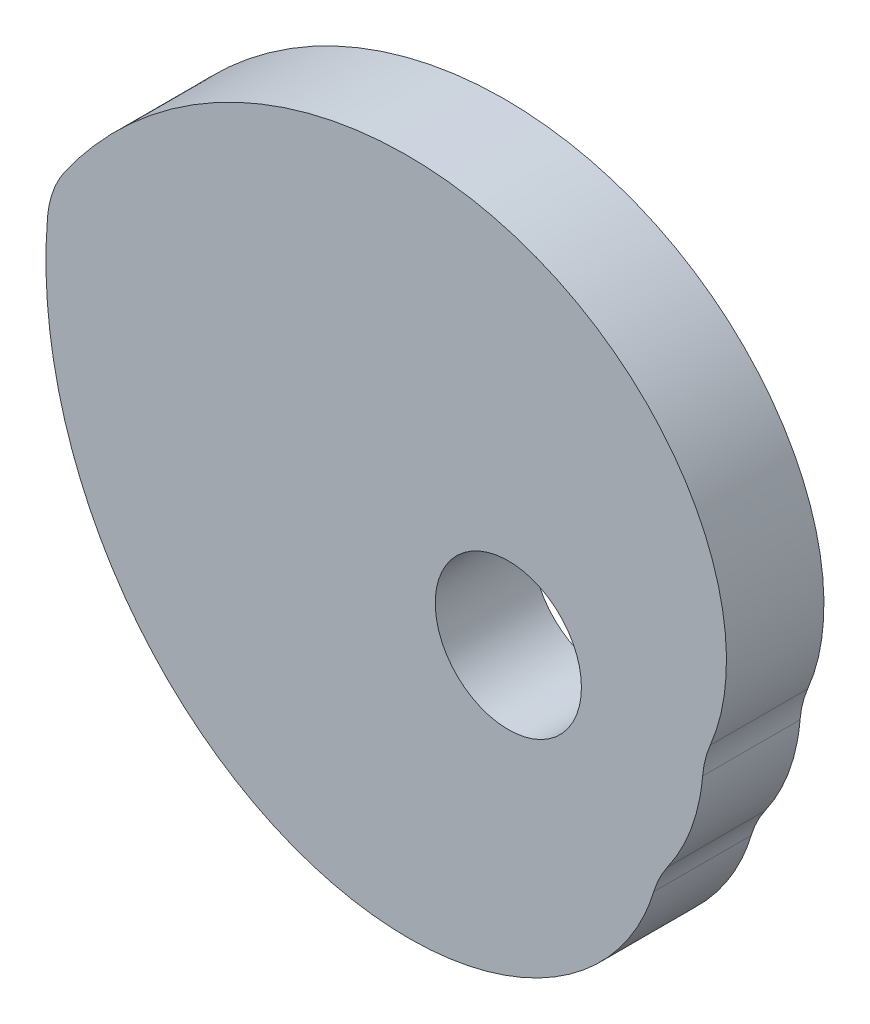
ISO-10303-21;
HEADER;
FILE_DESCRIPTION(('STEP AP214'),'2;1');
FILE_NAME('part.step','',(''),(''),'','','');
FILE_SCHEMA(('AUTOMOTIVE_DESIGN { 1 0 10303 214 1 1 1 1 }'));
ENDSEC;
DATA;
#1=APPLICATION_CONTEXT('core data for automotive mechanical design processes');
#2=APPLICATION_PROTOCOL_DEFINITION('international standard','automotive_design',2000,#1);
#3=PRODUCT_CONTEXT('',#1,'mechanical');
#4=PRODUCT('Part','Part','',(#3));
#5=PRODUCT_RELATED_PRODUCT_CATEGORY('part','',(#4));
#6=PRODUCT_DEFINITION_FORMATION('','',#4);
#7=PRODUCT_DEFINITION_CONTEXT('part definition',#1,'design');
#8=PRODUCT_DEFINITION('design','',#6,#7);
#9=PRODUCT_DEFINITION_SHAPE('','',#8);
#10=(LENGTH_UNIT() NAMED_UNIT(*) SI_UNIT(.MILLI.,.METRE.));
#11=(NAMED_UNIT(*) PLANE_ANGLE_UNIT() SI_UNIT($,.RADIAN.));
#12=(NAMED_UNIT(*) SI_UNIT($,.STERADIAN.) SOLID_ANGLE_UNIT());
#13=UNCERTAINTY_MEASURE_WITH_UNIT(LENGTH_MEASURE(1.E-05),#10,'distance_accuracy_value','');
#14=(GEOMETRIC_REPRESENTATION_CONTEXT(3) GLOBAL_UNCERTAINTY_ASSIGNED_CONTEXT((#13)) GLOBAL_UNIT_ASSIGNED_CONTEXT((#10,
#11,#12)) REPRESENTATION_CONTEXT('',''));
#15=CARTESIAN_POINT('',(0.,0.,0.));
#16=DIRECTION('',(0.,0.,1.));
#17=DIRECTION('',(1.,0.,0.));
#18=AXIS2_PLACEMENT_3D('',#15,#16,#17);
#19=CARTESIAN_POINT('',(18.7938548629415,-6.84044024509855,10.));
#20=DIRECTION('',(0.,0.,-1.));
#21=DIRECTION('',(-1.,0.,0.));
#22=AXIS2_PLACEMENT_3D('',#19,#20,#21);
#23=PLANE('',#22);
#24=CARTESIAN_POINT('',(19.9999999999879,-2.24527674983963E-11,10.));
#25=CARTESIAN_POINT('',(20.0204097483194,0.0379965128148901,10.));
#26=CARTESIAN_POINT('',(20.0609280240814,0.114187013648004,10.));
#27=CARTESIAN_POINT('',(20.1296494196752,0.245531012543593,10.));
#28=CARTESIAN_POINT('',(20.2275241780439,0.436799942401374,10.));
#29=CARTESIAN_POINT('',(20.3208034664597,0.624005392507609,10.));
#30=CARTESIAN_POINT('',(20.4081019037604,0.804544759706207,10.));
#31=CARTESIAN_POINT('',(20.5131313412369,1.02815385264695,10.));
#32=CARTESIAN_POINT('',(20.6363797819472,1.30013818971475,10.));
#33=CARTESIAN_POINT('',(20.7758903482779,1.6222756030741,10.));
#34=CARTESIAN_POINT('',(20.9645617633281,2.084363584331,10.));
#35=CARTESIAN_POINT('',(21.176160839209,2.64559749405615,10.));
#36=CARTESIAN_POINT('',(21.4007629477693,3.30806033936728,10.));
#37=CARTESIAN_POINT('',(21.6273488174109,4.07487951131544,10.));
#38=CARTESIAN_POINT('',(21.823879559792,4.8498522371115,10.));
#39=CARTESIAN_POINT('',(21.9906284990535,5.63181490838659,10.));
#40=CARTESIAN_POINT('',(22.1278049452484,6.41947130743867,10.));
#41=CARTESIAN_POINT('',(22.3436053863841,8.00388273953431,10.));
#42=CARTESIAN_POINT('',(22.4442951122128,10.0042245039902,10.));
#43=CARTESIAN_POINT('',(22.3243066427814,12.2058750284528,10.));
#44=CARTESIAN_POINT('',(21.8654144577139,14.9688026001635,10.));
#45=CARTESIAN_POINT('',(21.194781507287,17.4828155762556,10.));
#46=CARTESIAN_POINT('',(20.1969757731185,20.1038066062594,10.));
#47=CARTESIAN_POINT('',(18.7113489013894,22.9431355717934,10.));
#48=CARTESIAN_POINT('',(16.9138500048525,25.5953748073037,10.));
#49=CARTESIAN_POINT('',(14.8380325404183,28.0353206317477,10.));
#50=CARTESIAN_POINT('',(12.4818259426359,30.2764381155772,10.));
#51=CARTESIAN_POINT('',(9.90555179424934,32.2606211810121,10.));
#52=CARTESIAN_POINT('',(7.14305811783173,33.9753735162547,10.));
#53=CARTESIAN_POINT('',(3.50889536337627,35.7659948198949,10.));
#54=CARTESIAN_POINT('',(-1.03750504825736,37.3421983817775,10.));
#55=CARTESIAN_POINT('',(-5.77604938901733,38.2267587258342,10.));
#56=CARTESIAN_POINT('',(-10.5806024699092,38.4309484621174,10.));
#57=CARTESIAN_POINT('',(-14.5726455619449,38.1616533446731,10.));
#58=CARTESIAN_POINT('',(-17.7383781952531,37.6895165471296,10.));
#59=CARTESIAN_POINT('',(-20.8568128980475,36.9688971417918,10.));
#60=CARTESIAN_POINT('',(-23.9099702533807,36.0090232076047,10.));
#61=CARTESIAN_POINT('',(-26.8812762977102,34.8200135111463,10.));
#62=CARTESIAN_POINT('',(-29.7555133682477,33.4127337098064,10.));
#63=CARTESIAN_POINT('',(-32.5188125113099,31.7986465765908,10.));
#64=CARTESIAN_POINT('',(-34.8285960901609,30.2158714446315,10.));
#65=CARTESIAN_POINT('',(-36.7241333718976,28.7451553234462,10.));
#66=CARTESIAN_POINT('',(-38.2443574482205,27.4475496592739,10.));
#67=CARTESIAN_POINT('',(-39.4237742822328,26.3677550232443,10.));
#68=CARTESIAN_POINT('',(-40.5651565083509,25.2481030311785,10.));
#69=CARTESIAN_POINT('',(-41.6677405990869,24.0897583556483,10.));
#70=CARTESIAN_POINT('',(-42.5972248584368,23.0445249199807,10.));
#71=CARTESIAN_POINT('',(-43.3688549035856,22.1258909750647,10.));
#72=CARTESIAN_POINT('',(-44.1189030097488,21.1916190141886,10.));
#73=CARTESIAN_POINT('',(-44.8496523309867,20.2381583362847,10.));
#74=CARTESIAN_POINT('',(-45.4919080080513,19.3510692233448,10.));
#75=CARTESIAN_POINT('',(-46.0606176003423,18.5223338128647,10.));
#76=CARTESIAN_POINT('',(-46.4427890796628,17.9459927847963,10.));
#77=CARTESIAN_POINT('',(-46.6632646744318,17.6071654053237,10.));
#78=CARTESIAN_POINT('',(-46.8452528544985,17.3219476650775,10.));
#79=CARTESIAN_POINT('',(-46.9387577929684,17.1740612481532,10.));
#80=CARTESIAN_POINT('',(-46.9846310390559,17.1010071666017,10.));
#81=B_SPLINE_CURVE_WITH_KNOTS('',4,(#24,#25,#26,#27,#28,#29,#30,#31,#32,#33,#34,#35,#36,#37,#38,
#39,#40,#41,#42,#43,#44,#45,#46,#47,#48,#49,#50,#51,#52,#53,#54,#55,#56,#57,#58,#59,#60,#61,#62,
#63,#64,#65,#66,#67,#68,#69,#70,#71,#72,#73,#74,#75,#76,#77,#78,#79,#80),.UNSPECIFIED.,.F.,.F.,
(5,1,1,1,1,1,1,1,1,1,1,1,1,1,1,1,1,1,1,1,1,1,1,1,1,1,1,1,1,1,1,1,1,1,1,1,1,1,1,1,1,1,1,1,1,1,1,
1,1,1,1,1,1,5),(0.0503242083772643,0.0520072149040129,0.0536902214307616,0.0553732279575102,
0.0570562344842589,0.0587392410110075,0.0604222475377561,0.0637882605912534,0.0671542736447507,
0.070520286698248,0.0772523128052425,0.0839843545816734,0.0907163963581042,0.097448438134535,
0.104180479910966,0.110912520639153,0.117644561367341,0.151304782348487,0.171500943792439,
0.184965058728134,0.211893340533307,0.238821591242818,0.265749805809011,0.2926780756731,
0.319606256186562,0.346534414236532,0.375101606641735,0.402029828716349,0.428958050790962,
0.482814419792515,0.536670848396968,0.563599054732377,0.590527261067786,0.617455470025173,
0.644383678982561,0.671311911267779,0.698240143552998,0.725168325260391,0.752096506967784,
0.779024722071599,0.792488829623506,0.805952937175413,0.81941704062619,0.832881144076967,
0.846345247527744,0.85980935097852,0.86654141433011,0.873273477681699,0.886737604384878,
0.900201731088057,0.903567762763852,0.906933794439647,0.910299826115442,0.913665857807332),.UNSPECIFIED.);
#82=CARTESIAN_POINT('',(20.7121956288001,1.47705325865104,10.));
#83=VERTEX_POINT('',#82);
#84=CARTESIAN_POINT('',(-45.4742768342118,19.3636683877185,10.));
#85=VERTEX_POINT('',#84);
#86=EDGE_CURVE('E120',#83,#85,#81,.T.);
#87=ORIENTED_EDGE('',*,*,#86,.T.);
#88=CARTESIAN_POINT('',(-37.3154183962621,13.5815382448125,10.));
#89=DIRECTION('',(0.,0.,-1.));
#90=DIRECTION('',(-1.,0.,0.));
#91=AXIS2_PLACEMENT_3D('',#88,#89,#90);
#92=CIRCLE('',#91,10.);
#93=CARTESIAN_POINT('',(-47.2809797508623,14.4107468360002,10.));
#94=VERTEX_POINT('',#93);
#95=EDGE_CURVE('E137',#85,#94,#92,.F.);
#96=ORIENTED_EDGE('',*,*,#95,.T.);
#97=CARTESIAN_POINT('',(-46.9846310394559,17.1010071650349,10.));
#98=CARTESIAN_POINT('',(-47.0082456871718,16.9302527734567,10.));
#99=CARTESIAN_POINT('',(-47.0524535052723,16.5947479586867,10.));
#100=CARTESIAN_POINT('',(-47.1477228803686,15.8344873652796,10.));
#101=CARTESIAN_POINT('',(-47.2145282585826,15.1607151878363,10.));
#102=CARTESIAN_POINT('',(-47.2939655925661,14.2997795026236,10.));
#103=CARTESIAN_POINT('',(-47.3463146566364,13.538629172792,10.));
#104=CARTESIAN_POINT('',(-47.392988991168,12.7221862853459,10.));
#105=CARTESIAN_POINT('',(-47.4224681563362,11.9335386078335,10.));
#106=CARTESIAN_POINT('',(-47.4449464949847,10.930726824676,10.));
#107=CARTESIAN_POINT('',(-47.4440100533896,9.73537639316078,10.));
#108=CARTESIAN_POINT('',(-47.4043610387653,8.33636859835342,10.));
#109=CARTESIAN_POINT('',(-47.3045117637342,6.7427200005541,10.));
#110=CARTESIAN_POINT('',(-47.1118460767452,4.75456572703781,10.));
#111=CARTESIAN_POINT('',(-46.7711628464939,2.38206492022191,10.));
#112=CARTESIAN_POINT('',(-46.2134814329126,-0.359572325500851,10.));
#113=CARTESIAN_POINT('',(-45.3558724861621,-3.43966023382565,10.));
#114=CARTESIAN_POINT('',(-44.4134313444758,-6.07399119269932,10.));
#115=CARTESIAN_POINT('',(-43.4696331236094,-8.27760572432263,10.));
#116=CARTESIAN_POINT('',(-42.5935028912988,-10.0723050508397,10.));
#117=CARTESIAN_POINT('',(-41.8393033212344,-11.4807786587544,10.));
#118=CARTESIAN_POINT('',(-40.8306695483903,-13.2045020761333,10.));
#119=CARTESIAN_POINT('',(-39.5162413622496,-15.2093846473497,10.));
#120=CARTESIAN_POINT('',(-37.8343483377083,-17.4456667376354,10.));
#121=CARTESIAN_POINT('',(-35.7164759706582,-19.8419214086793,10.));
#122=CARTESIAN_POINT('',(-32.8364228977129,-22.6144797646757,10.));
#123=CARTESIAN_POINT('',(-29.0308900403572,-25.5477378650922,10.));
#124=CARTESIAN_POINT('',(-24.8387562860033,-27.9189091912714,10.));
#125=CARTESIAN_POINT('',(-20.3490174463282,-29.638470378975,10.));
#126=CARTESIAN_POINT('',(-16.3978371569557,-30.6131035418182,10.));
#127=CARTESIAN_POINT('',(-13.1608984891533,-31.0804644270731,10.));
#128=CARTESIAN_POINT('',(-9.89285760648513,-31.2172377135783,10.));
#129=CARTESIAN_POINT('',(-6.62860649731071,-31.0109380229328,10.));
#130=CARTESIAN_POINT('',(-3.47318946941449,-30.4740142404615,10.));
#131=CARTESIAN_POINT('',(-0.394676097194339,-29.5961124425629,10.));
#132=CARTESIAN_POINT('',(2.56511220188381,-28.3750067098918,10.));
#133=CARTESIAN_POINT('',(5.36075443962893,-26.8129909463062,10.));
#134=CARTESIAN_POINT('',(7.78176877064147,-25.0363263236066,10.));
#135=CARTESIAN_POINT('',(9.97421790022491,-22.9859434968016,10.));
#136=CARTESIAN_POINT('',(11.6395879197605,-20.986683375703,10.));
#137=CARTESIAN_POINT('',(12.7488108072939,-19.3214147995504,10.));
#138=CARTESIAN_POINT('',(13.5158199765842,-17.9192791991142,10.));
#139=CARTESIAN_POINT('',(13.9063789675469,-17.1098595692014,10.));
#140=CARTESIAN_POINT('',(14.1491007414472,-16.5621527709134,10.));
#141=CARTESIAN_POINT('',(14.3392950578918,-16.1006107121126,10.));
#142=CARTESIAN_POINT('',(14.4840892836061,-15.7283917714127,10.));
#143=CARTESIAN_POINT('',(14.6213730478864,-15.3534331536415,10.));
#144=CARTESIAN_POINT('',(14.7510110913021,-14.9759175006689,10.));
#145=CARTESIAN_POINT('',(14.873112976707,-14.5948559779304,10.));
#146=CARTESIAN_POINT('',(14.9872762371851,-14.211724792835,10.));
#147=CARTESIAN_POINT('',(15.0919629809289,-13.8334610044016,10.));
#148=CARTESIAN_POINT('',(15.1912987381234,-13.4397981853838,10.));
#149=CARTESIAN_POINT('',(15.2669422812024,-13.1079060174855,10.));
#150=CARTESIAN_POINT('',(15.3033259025708,-12.9401330692189,10.));
#151=CARTESIAN_POINT('',(15.3208888626936,-12.855752193845,10.));
#152=B_SPLINE_CURVE_WITH_KNOTS('',4,(#97,#98,#99,#100,#101,#102,#103,#104,#105,#106,#107,#108,
#109,#110,#111,#112,#113,#114,#115,#116,#117,#118,#119,#120,#121,#122,#123,#124,#125,#126,#127,
#128,#129,#130,#131,#132,#133,#134,#135,#136,#137,#138,#139,#140,#141,#142,#143,#144,#145,#146,
#147,#148,#149,#150,#151),.UNSPECIFIED.,.F.,.F.,(5,1,1,1,1,1,1,1,1,1,1,1,1,1,1,1,1,1,1,1,1,1,1,
1,1,1,1,1,1,1,1,1,1,1,1,1,1,1,1,1,1,1,1,1,1,1,1,1,1,1,1,5),(0.0863341423065396,
0.0930605149533579,0.0997868876001762,0.106513260246995,0.113239632893813,0.119966005540631,
0.126692378187449,0.133418750834268,0.140145123481086,0.153597846020344,0.167050568559602,
0.18050329109886,0.193956013638118,0.220861465703268,0.247766917768418,0.27467233838176,
0.301577758995101,0.315030493227828,0.328483227460554,0.34193596169328,0.355388695926006,
0.382294141810194,0.409199587694381,0.436105030563347,0.463010473432313,0.516821377673064,
0.570632207222086,0.597537677137857,0.624443147053627,0.653716037772041,0.68062142158155,
0.70752685352601,0.734432293020325,0.76133769405239,0.788243181078102,0.815148711392046,
0.842054217185708,0.862233311546484,0.889138718294404,0.90259141482238,0.909317764030024,
0.916044113237668,0.919407287841491,0.922770462445313,0.926133628675341,0.92949679490537,
0.932859961135398,0.936223127365427,0.939586293595455,0.942949459825484,0.946312626055512,
0.94967579228554),.UNSPECIFIED.);
#153=CARTESIAN_POINT('',(14.917567959421,-14.443164897138,10.));
#154=VERTEX_POINT('',#153);
#155=EDGE_CURVE('E110',#94,#154,#152,.T.);
#156=ORIENTED_EDGE('',*,*,#155,.T.);
#157=CARTESIAN_POINT('',(24.4945895229399,-17.3207781393756,10.));
#158=DIRECTION('',(0.,0.,-1.));
#159=DIRECTION('',(-1.,0.,0.));
#160=AXIS2_PLACEMENT_3D('',#157,#158,#159);
#161=CIRCLE('',#160,10.);
#162=CARTESIAN_POINT('',(16.3331557690414,-11.5422836052668,10.));
#163=VERTEX_POINT('',#162);
#164=EDGE_CURVE('E60',#154,#163,#161,.T.);
#165=ORIENTED_EDGE('',*,*,#164,.T.);
#166=CARTESIAN_POINT('',(15.3208888625617,-12.8557521940023,10.));
#167=CARTESIAN_POINT('',(15.36548207386,-12.8026080742307,10.));
#168=CARTESIAN_POINT('',(15.4539825668846,-12.6957045048991,10.));
#169=CARTESIAN_POINT('',(15.6631718521004,-12.4399549985542,10.));
#170=CARTESIAN_POINT('',(15.8275258133756,-12.2268936051864,10.));
#171=CARTESIAN_POINT('',(16.052433322957,-11.9330795218907,10.));
#172=CARTESIAN_POINT('',(16.2342623282037,-11.6820183924187,10.));
#173=CARTESIAN_POINT('',(16.4347647489964,-11.4001358463437,10.));
#174=CARTESIAN_POINT('',(16.6168848944818,-11.1315896108564,10.));
#175=CARTESIAN_POINT('',(16.8025566985642,-10.8502793327571,10.));
#176=CARTESIAN_POINT('',(16.9790143470563,-10.5713950365788,10.));
#177=CARTESIAN_POINT('',(17.1965400354153,-10.2158240714843,10.));
#178=CARTESIAN_POINT('',(17.4465815804882,-9.78518290402213,10.));
#179=CARTESIAN_POINT('',(17.7251951731012,-9.27384263695709,10.));
#180=CARTESIAN_POINT('',(18.0234564309182,-8.67969554942382,10.));
#181=CARTESIAN_POINT('',(18.3021068388519,-8.07585230219935,10.));
#182=CARTESIAN_POINT('',(18.5603528893541,-7.46289272350089,10.));
#183=CARTESIAN_POINT('',(18.7981954487022,-6.84221001350287,10.));
#184=CARTESIAN_POINT('',(19.0151994508668,-6.21297987693103,10.));
#185=CARTESIAN_POINT('',(19.2112294389024,-5.57858116913139,10.));
#186=CARTESIAN_POINT('',(19.3860054031515,-4.93517976426152,10.));
#187=CARTESIAN_POINT('',(19.5393727392047,-4.2910226653558,10.));
#188=CARTESIAN_POINT('',(19.6711385014395,-3.63436677889103,10.));
#189=CARTESIAN_POINT('',(19.7811713984607,-2.98652433616239,10.));
#190=CARTESIAN_POINT('',(19.8693410315871,-2.31397220022322,10.));
#191=CARTESIAN_POINT('',(19.935555478229,-1.67557472380869,10.));
#192=CARTESIAN_POINT('',(19.9742151319871,-1.05590856589907,10.));
#193=CARTESIAN_POINT('',(19.993553164701,-0.619587969925683,10.));
#194=CARTESIAN_POINT('',(19.9990790152708,-0.206445905495306,10.));
#195=CARTESIAN_POINT('',(19.9999999999959,-0.0693747215377148,10.));
#196=CARTESIAN_POINT('',(19.9999999999949,-2.03406620702656E-10,10.));
#197=B_SPLINE_CURVE_WITH_KNOTS('',4,(#166,#167,#168,#169,#170,#171,#172,#173,#174,#175,#176,
#177,#178,#179,#180,#181,#182,#183,#184,#185,#186,#187,#188,#189,#190,#191,#192,#193,#194,#195,
#196),.UNSPECIFIED.,.F.,.F.,(5,1,1,1,1,1,1,1,1,1,1,1,1,1,1,1,1,1,1,1,1,1,1,1,1,1,1,5),
(0.0826377295405765,0.102512123356954,0.122386517189105,0.142260911021257,0.162135304853408,
0.18200969868556,0.201884092517711,0.221758486349862,0.241632880182013,0.261507274014164,
0.281381667846314,0.321130455510616,0.360879243174918,0.40062803083922,0.440376818503521,
0.480125606167823,0.519874393832125,0.559623181496428,0.599371969160729,0.639120756825031,
0.678869544489333,0.718618332153637,0.75836711981794,0.798115907482244,0.837864695146548,
0.877613482810855,0.89748787664303,0.917362270489843),.UNSPECIFIED.);
#198=CARTESIAN_POINT('',(19.9312927845428,-1.65789991297878,10.));
#199=VERTEX_POINT('',#198);
#200=EDGE_CURVE('E117',#163,#199,#197,.T.);
#201=ORIENTED_EDGE('',*,*,#200,.T.);
#202=CARTESIAN_POINT('',(29.8977907811906,-2.47577379250868,10.));
#203=DIRECTION('',(0.,0.,-1.));
#204=DIRECTION('',(-1.,0.,0.));
#205=AXIS2_PLACEMENT_3D('',#202,#203,#204);
#206=CIRCLE('',#205,10.);
#207=EDGE_CURVE('E11',#199,#83,#206,.T.);
#208=ORIENTED_EDGE('',*,*,#207,.T.);
#209=EDGE_LOOP('',(#87,#96,#156,#165,#201,#208));
#210=FACE_BOUND('',#209,.T.);
#211=CARTESIAN_POINT('',(0.,0.,10.));
#212=DIRECTION('',(0.,0.,1.));
#213=DIRECTION('',(1.,0.,0.));
#214=AXIS2_PLACEMENT_3D('',#211,#212,#213);
#215=CIRCLE('',#214,7.5);
#216=CARTESIAN_POINT('',(7.5,0.,10.));
#217=VERTEX_POINT('',#216);
#218=EDGE_CURVE('E148',#217,#217,#215,.T.);
#219=ORIENTED_EDGE('',*,*,#218,.F.);
#220=EDGE_LOOP('',(#219));
#221=FACE_BOUND('',#220,.T.);
#222=ADVANCED_FACE('F38',(#210,#221),#23,.F.);
#223=CARTESIAN_POINT('',(18.7938548629415,-6.84044024509855,0.));
#224=DIRECTION('',(0.,0.,-1.));
#225=DIRECTION('',(-1.,0.,0.));
#226=AXIS2_PLACEMENT_3D('',#223,#224,#225);
#227=PLANE('',#226);
#228=CARTESIAN_POINT('',(-46.9846310394559,17.1010071650349,0.));
#229=CARTESIAN_POINT('',(-47.0082456871718,16.9302527734567,0.));
#230=CARTESIAN_POINT('',(-47.0524535052723,16.5947479586867,0.));
#231=CARTESIAN_POINT('',(-47.1477228803686,15.8344873652796,0.));
#232=CARTESIAN_POINT('',(-47.2145282585826,15.1607151878363,0.));
#233=CARTESIAN_POINT('',(-47.2939655925661,14.2997795026236,0.));
#234=CARTESIAN_POINT('',(-47.3463146566364,13.538629172792,0.));
#235=CARTESIAN_POINT('',(-47.392988991168,12.7221862853459,0.));
#236=CARTESIAN_POINT('',(-47.4224681563362,11.9335386078335,0.));
#237=CARTESIAN_POINT('',(-47.4449464949847,10.930726824676,0.));
#238=CARTESIAN_POINT('',(-47.4440100533896,9.73537639316078,0.));
#239=CARTESIAN_POINT('',(-47.4043610387653,8.33636859835342,0.));
#240=CARTESIAN_POINT('',(-47.3045117637342,6.7427200005541,0.));
#241=CARTESIAN_POINT('',(-47.1118460767452,4.75456572703781,0.));
#242=CARTESIAN_POINT('',(-46.7711628464939,2.38206492022191,0.));
#243=CARTESIAN_POINT('',(-46.2134814329126,-0.359572325500851,0.));
#244=CARTESIAN_POINT('',(-45.3558724861621,-3.43966023382565,0.));
#245=CARTESIAN_POINT('',(-44.4134313444758,-6.07399119269932,0.));
#246=CARTESIAN_POINT('',(-43.4696331236094,-8.27760572432263,0.));
#247=CARTESIAN_POINT('',(-42.5935028912988,-10.0723050508397,0.));
#248=CARTESIAN_POINT('',(-41.8393033212344,-11.4807786587544,0.));
#249=CARTESIAN_POINT('',(-40.8306695483903,-13.2045020761333,0.));
#250=CARTESIAN_POINT('',(-39.5162413622496,-15.2093846473497,0.));
#251=CARTESIAN_POINT('',(-37.8343483377083,-17.4456667376354,0.));
#252=CARTESIAN_POINT('',(-35.7164759706582,-19.8419214086793,0.));
#253=CARTESIAN_POINT('',(-32.8364228977129,-22.6144797646757,0.));
#254=CARTESIAN_POINT('',(-29.0308900403572,-25.5477378650922,0.));
#255=CARTESIAN_POINT('',(-24.8387562860033,-27.9189091912714,0.));
#256=CARTESIAN_POINT('',(-20.3490174463282,-29.638470378975,0.));
#257=CARTESIAN_POINT('',(-16.3978371569557,-30.6131035418182,0.));
#258=CARTESIAN_POINT('',(-13.1608984891533,-31.0804644270731,0.));
#259=CARTESIAN_POINT('',(-9.89285760648513,-31.2172377135783,0.));
#260=CARTESIAN_POINT('',(-6.62860649731071,-31.0109380229328,0.));
#261=CARTESIAN_POINT('',(-3.47318946941449,-30.4740142404615,0.));
#262=CARTESIAN_POINT('',(-0.394676097194339,-29.5961124425629,0.));
#263=CARTESIAN_POINT('',(2.56511220188381,-28.3750067098918,0.));
#264=CARTESIAN_POINT('',(5.36075443962893,-26.8129909463062,0.));
#265=CARTESIAN_POINT('',(7.78176877064147,-25.0363263236066,0.));
#266=CARTESIAN_POINT('',(9.97421790022491,-22.9859434968016,0.));
#267=CARTESIAN_POINT('',(11.6395879197605,-20.986683375703,0.));
#268=CARTESIAN_POINT('',(12.7488108072939,-19.3214147995504,0.));
#269=CARTESIAN_POINT('',(13.5158199765842,-17.9192791991142,0.));
#270=CARTESIAN_POINT('',(13.9063789675469,-17.1098595692014,0.));
#271=CARTESIAN_POINT('',(14.1491007414472,-16.5621527709134,0.));
#272=CARTESIAN_POINT('',(14.3392950578918,-16.1006107121126,0.));
#273=CARTESIAN_POINT('',(14.4840892836061,-15.7283917714127,0.));
#274=CARTESIAN_POINT('',(14.6213730478864,-15.3534331536415,0.));
#275=CARTESIAN_POINT('',(14.7510110913021,-14.9759175006689,0.));
#276=CARTESIAN_POINT('',(14.873112976707,-14.5948559779304,0.));
#277=CARTESIAN_POINT('',(14.9872762371851,-14.211724792835,0.));
#278=CARTESIAN_POINT('',(15.0919629809289,-13.8334610044016,0.));
#279=CARTESIAN_POINT('',(15.1912987381234,-13.4397981853838,0.));
#280=CARTESIAN_POINT('',(15.2669422812024,-13.1079060174855,0.));
#281=CARTESIAN_POINT('',(15.3033259025708,-12.9401330692189,0.));
#282=CARTESIAN_POINT('',(15.3208888626936,-12.855752193845,0.));
#283=B_SPLINE_CURVE_WITH_KNOTS('',4,(#228,#229,#230,#231,#232,#233,#234,#235,#236,#237,#238,
#239,#240,#241,#242,#243,#244,#245,#246,#247,#248,#249,#250,#251,#252,#253,#254,#255,#256,#257,
#258,#259,#260,#261,#262,#263,#264,#265,#266,#267,#268,#269,#270,#271,#272,#273,#274,#275,#276,
#277,#278,#279,#280,#281,#282),.UNSPECIFIED.,.F.,.F.,(5,1,1,1,1,1,1,1,1,1,1,1,1,1,1,1,1,1,1,1,1,
1,1,1,1,1,1,1,1,1,1,1,1,1,1,1,1,1,1,1,1,1,1,1,1,1,1,1,1,1,1,5),(0.0863341423065396,
0.0930605149533579,0.0997868876001762,0.106513260246995,0.113239632893813,0.119966005540631,
0.126692378187449,0.133418750834268,0.140145123481086,0.153597846020344,0.167050568559602,
0.18050329109886,0.193956013638118,0.220861465703268,0.247766917768418,0.27467233838176,
0.301577758995101,0.315030493227828,0.328483227460554,0.34193596169328,0.355388695926006,
0.382294141810194,0.409199587694381,0.436105030563347,0.463010473432313,0.516821377673064,
0.570632207222086,0.597537677137857,0.624443147053627,0.653716037772041,0.68062142158155,
0.70752685352601,0.734432293020325,0.76133769405239,0.788243181078102,0.815148711392046,
0.842054217185708,0.862233311546484,0.889138718294404,0.90259141482238,0.909317764030024,
0.916044113237668,0.919407287841491,0.922770462445313,0.926133628675341,0.92949679490537,
0.932859961135398,0.936223127365427,0.939586293595455,0.942949459825484,0.946312626055512,
0.94967579228554),.UNSPECIFIED.);
#284=CARTESIAN_POINT('',(-47.2809797508623,14.4107468360002,0.));
#285=VERTEX_POINT('',#284);
#286=CARTESIAN_POINT('',(14.917567959421,-14.443164897138,0.));
#287=VERTEX_POINT('',#286);
#288=EDGE_CURVE('E108',#285,#287,#283,.T.);
#289=ORIENTED_EDGE('',*,*,#288,.F.);
#290=CARTESIAN_POINT('',(-37.3154183962621,13.5815382448125,0.));
#291=DIRECTION('',(0.,0.,-1.));
#292=DIRECTION('',(-1.,0.,0.));
#293=AXIS2_PLACEMENT_3D('',#290,#291,#292);
#294=CIRCLE('',#293,10.);
#295=CARTESIAN_POINT('',(-45.4742768342118,19.3636683877185,0.));
#296=VERTEX_POINT('',#295);
#297=EDGE_CURVE('E92',#285,#296,#294,.T.);
#298=ORIENTED_EDGE('',*,*,#297,.T.);
#299=CARTESIAN_POINT('',(19.9999999999879,-2.24527674983963E-11,0.));
#300=CARTESIAN_POINT('',(20.0204097483194,0.0379965128148901,0.));
#301=CARTESIAN_POINT('',(20.0609280240814,0.114187013648004,0.));
#302=CARTESIAN_POINT('',(20.1296494196752,0.245531012543593,0.));
#303=CARTESIAN_POINT('',(20.2275241780439,0.436799942401374,0.));
#304=CARTESIAN_POINT('',(20.3208034664597,0.624005392507609,0.));
#305=CARTESIAN_POINT('',(20.4081019037604,0.804544759706207,0.));
#306=CARTESIAN_POINT('',(20.5131313412369,1.02815385264695,0.));
#307=CARTESIAN_POINT('',(20.6363797819472,1.30013818971475,0.));
#308=CARTESIAN_POINT('',(20.7758903482779,1.6222756030741,0.));
#309=CARTESIAN_POINT('',(20.9645617633281,2.084363584331,0.));
#310=CARTESIAN_POINT('',(21.176160839209,2.64559749405615,0.));
#311=CARTESIAN_POINT('',(21.4007629477693,3.30806033936728,0.));
#312=CARTESIAN_POINT('',(21.6273488174109,4.07487951131544,0.));
#313=CARTESIAN_POINT('',(21.823879559792,4.8498522371115,0.));
#314=CARTESIAN_POINT('',(21.9906284990535,5.63181490838659,0.));
#315=CARTESIAN_POINT('',(22.1278049452484,6.41947130743867,0.));
#316=CARTESIAN_POINT('',(22.3436053863841,8.00388273953431,0.));
#317=CARTESIAN_POINT('',(22.4442951122128,10.0042245039902,0.));
#318=CARTESIAN_POINT('',(22.3243066427814,12.2058750284528,0.));
#319=CARTESIAN_POINT('',(21.8654144577139,14.9688026001635,0.));
#320=CARTESIAN_POINT('',(21.194781507287,17.4828155762556,0.));
#321=CARTESIAN_POINT('',(20.1969757731185,20.1038066062594,0.));
#322=CARTESIAN_POINT('',(18.7113489013894,22.9431355717934,0.));
#323=CARTESIAN_POINT('',(16.9138500048525,25.5953748073037,0.));
#324=CARTESIAN_POINT('',(14.8380325404183,28.0353206317477,0.));
#325=CARTESIAN_POINT('',(12.4818259426359,30.2764381155772,0.));
#326=CARTESIAN_POINT('',(9.90555179424934,32.2606211810121,0.));
#327=CARTESIAN_POINT('',(7.14305811783173,33.9753735162547,0.));
#328=CARTESIAN_POINT('',(3.50889536337627,35.7659948198949,0.));
#329=CARTESIAN_POINT('',(-1.03750504825736,37.3421983817775,0.));
#330=CARTESIAN_POINT('',(-5.77604938901733,38.2267587258342,0.));
#331=CARTESIAN_POINT('',(-10.5806024699092,38.4309484621174,0.));
#332=CARTESIAN_POINT('',(-14.5726455619449,38.1616533446731,0.));
#333=CARTESIAN_POINT('',(-17.7383781952531,37.6895165471296,0.));
#334=CARTESIAN_POINT('',(-20.8568128980475,36.9688971417918,0.));
#335=CARTESIAN_POINT('',(-23.9099702533807,36.0090232076047,0.));
#336=CARTESIAN_POINT('',(-26.8812762977102,34.8200135111463,0.));
#337=CARTESIAN_POINT('',(-29.7555133682477,33.4127337098064,0.));
#338=CARTESIAN_POINT('',(-32.5188125113099,31.7986465765908,0.));
#339=CARTESIAN_POINT('',(-34.8285960901609,30.2158714446315,0.));
#340=CARTESIAN_POINT('',(-36.7241333718976,28.7451553234462,0.));
#341=CARTESIAN_POINT('',(-38.2443574482205,27.4475496592739,0.));
#342=CARTESIAN_POINT('',(-39.4237742822328,26.3677550232443,0.));
#343=CARTESIAN_POINT('',(-40.5651565083509,25.2481030311785,0.));
#344=CARTESIAN_POINT('',(-41.6677405990869,24.0897583556483,0.));
#345=CARTESIAN_POINT('',(-42.5972248584368,23.0445249199807,0.));
#346=CARTESIAN_POINT('',(-43.3688549035856,22.1258909750647,0.));
#347=CARTESIAN_POINT('',(-44.1189030097488,21.1916190141886,0.));
#348=CARTESIAN_POINT('',(-44.8496523309867,20.2381583362847,0.));
#349=CARTESIAN_POINT('',(-45.4919080080513,19.3510692233448,0.));
#350=CARTESIAN_POINT('',(-46.0606176003423,18.5223338128647,0.));
#351=CARTESIAN_POINT('',(-46.4427890796628,17.9459927847963,0.));
#352=CARTESIAN_POINT('',(-46.6632646744318,17.6071654053237,0.));
#353=CARTESIAN_POINT('',(-46.8452528544985,17.3219476650775,0.));
#354=CARTESIAN_POINT('',(-46.9387577929684,17.1740612481532,0.));
#355=CARTESIAN_POINT('',(-46.9846310390559,17.1010071666017,0.));
#356=B_SPLINE_CURVE_WITH_KNOTS('',4,(#299,#300,#301,#302,#303,#304,#305,#306,#307,#308,#309,
#310,#311,#312,#313,#314,#315,#316,#317,#318,#319,#320,#321,#322,#323,#324,#325,#326,#327,#328,
#329,#330,#331,#332,#333,#334,#335,#336,#337,#338,#339,#340,#341,#342,#343,#344,#345,#346,#347,
#348,#349,#350,#351,#352,#353,#354,#355),.UNSPECIFIED.,.F.,.F.,(5,1,1,1,1,1,1,1,1,1,1,1,1,1,1,1,
1,1,1,1,1,1,1,1,1,1,1,1,1,1,1,1,1,1,1,1,1,1,1,1,1,1,1,1,1,1,1,1,1,1,1,1,1,5),
(0.0503242083772643,0.0520072149040129,0.0536902214307616,0.0553732279575102,0.0570562344842589,
0.0587392410110075,0.0604222475377561,0.0637882605912534,0.0671542736447507,0.070520286698248,
0.0772523128052425,0.0839843545816734,0.0907163963581042,0.097448438134535,0.104180479910966,
0.110912520639153,0.117644561367341,0.151304782348487,0.171500943792439,0.184965058728134,
0.211893340533307,0.238821591242818,0.265749805809011,0.2926780756731,0.319606256186562,
0.346534414236532,0.375101606641735,0.402029828716349,0.428958050790962,0.482814419792515,
0.536670848396968,0.563599054732377,0.590527261067786,0.617455470025173,0.644383678982561,
0.671311911267779,0.698240143552998,0.725168325260391,0.752096506967784,0.779024722071599,
0.792488829623506,0.805952937175413,0.81941704062619,0.832881144076967,0.846345247527744,
0.85980935097852,0.86654141433011,0.873273477681699,0.886737604384878,0.900201731088057,
0.903567762763852,0.906933794439647,0.910299826115442,0.913665857807332),.UNSPECIFIED.);
#357=CARTESIAN_POINT('',(20.7121956288001,1.47705325865104,0.));
#358=VERTEX_POINT('',#357);
#359=EDGE_CURVE('E118',#358,#296,#356,.T.);
#360=ORIENTED_EDGE('',*,*,#359,.F.);
#361=CARTESIAN_POINT('',(29.8977907811906,-2.47577379250868,0.));
#362=DIRECTION('',(0.,0.,-1.));
#363=DIRECTION('',(-1.,0.,0.));
#364=AXIS2_PLACEMENT_3D('',#361,#362,#363);
#365=CIRCLE('',#364,10.);
#366=CARTESIAN_POINT('',(19.9312927845428,-1.65789991297878,0.));
#367=VERTEX_POINT('',#366);
#368=EDGE_CURVE('E46',#358,#367,#365,.F.);
#369=ORIENTED_EDGE('',*,*,#368,.T.);
#370=CARTESIAN_POINT('',(15.3208888625617,-12.8557521940023,0.));
#371=CARTESIAN_POINT('',(15.36548207386,-12.8026080742307,0.));
#372=CARTESIAN_POINT('',(15.4539825668846,-12.6957045048991,0.));
#373=CARTESIAN_POINT('',(15.6631718521004,-12.4399549985542,0.));
#374=CARTESIAN_POINT('',(15.8275258133756,-12.2268936051864,0.));
#375=CARTESIAN_POINT('',(16.052433322957,-11.9330795218907,0.));
#376=CARTESIAN_POINT('',(16.2342623282037,-11.6820183924187,0.));
#377=CARTESIAN_POINT('',(16.4347647489964,-11.4001358463437,0.));
#378=CARTESIAN_POINT('',(16.6168848944818,-11.1315896108564,0.));
#379=CARTESIAN_POINT('',(16.8025566985642,-10.8502793327571,0.));
#380=CARTESIAN_POINT('',(16.9790143470563,-10.5713950365788,0.));
#381=CARTESIAN_POINT('',(17.1965400354153,-10.2158240714843,0.));
#382=CARTESIAN_POINT('',(17.4465815804882,-9.78518290402213,0.));
#383=CARTESIAN_POINT('',(17.7251951731012,-9.27384263695709,0.));
#384=CARTESIAN_POINT('',(18.0234564309182,-8.67969554942382,0.));
#385=CARTESIAN_POINT('',(18.3021068388519,-8.07585230219935,0.));
#386=CARTESIAN_POINT('',(18.5603528893541,-7.46289272350089,0.));
#387=CARTESIAN_POINT('',(18.7981954487022,-6.84221001350287,0.));
#388=CARTESIAN_POINT('',(19.0151994508668,-6.21297987693103,0.));
#389=CARTESIAN_POINT('',(19.2112294389024,-5.57858116913139,0.));
#390=CARTESIAN_POINT('',(19.3860054031515,-4.93517976426152,0.));
#391=CARTESIAN_POINT('',(19.5393727392047,-4.2910226653558,0.));
#392=CARTESIAN_POINT('',(19.6711385014395,-3.63436677889103,0.));
#393=CARTESIAN_POINT('',(19.7811713984607,-2.98652433616239,0.));
#394=CARTESIAN_POINT('',(19.8693410315871,-2.31397220022322,0.));
#395=CARTESIAN_POINT('',(19.935555478229,-1.67557472380869,0.));
#396=CARTESIAN_POINT('',(19.9742151319871,-1.05590856589907,0.));
#397=CARTESIAN_POINT('',(19.993553164701,-0.619587969925683,0.));
#398=CARTESIAN_POINT('',(19.9990790152708,-0.206445905495306,0.));
#399=CARTESIAN_POINT('',(19.9999999999959,-0.0693747215377148,0.));
#400=CARTESIAN_POINT('',(19.9999999999949,-2.03406620702656E-10,0.));
#401=B_SPLINE_CURVE_WITH_KNOTS('',4,(#370,#371,#372,#373,#374,#375,#376,#377,#378,#379,#380,
#381,#382,#383,#384,#385,#386,#387,#388,#389,#390,#391,#392,#393,#394,#395,#396,#397,#398,#399,
#400),.UNSPECIFIED.,.F.,.F.,(5,1,1,1,1,1,1,1,1,1,1,1,1,1,1,1,1,1,1,1,1,1,1,1,1,1,1,5),
(0.0826377295405765,0.102512123356954,0.122386517189105,0.142260911021257,0.162135304853408,
0.18200969868556,0.201884092517711,0.221758486349862,0.241632880182013,0.261507274014164,
0.281381667846314,0.321130455510616,0.360879243174918,0.40062803083922,0.440376818503521,
0.480125606167823,0.519874393832125,0.559623181496428,0.599371969160729,0.639120756825031,
0.678869544489333,0.718618332153637,0.75836711981794,0.798115907482244,0.837864695146548,
0.877613482810855,0.89748787664303,0.917362270489843),.UNSPECIFIED.);
#402=CARTESIAN_POINT('',(16.3331557690414,-11.5422836052668,0.));
#403=VERTEX_POINT('',#402);
#404=EDGE_CURVE('E122',#403,#367,#401,.T.);
#405=ORIENTED_EDGE('',*,*,#404,.F.);
#406=CARTESIAN_POINT('',(24.4945895229399,-17.3207781393756,0.));
#407=DIRECTION('',(0.,0.,-1.));
#408=DIRECTION('',(-1.,0.,0.));
#409=AXIS2_PLACEMENT_3D('',#406,#407,#408);
#410=CIRCLE('',#409,10.);
#411=EDGE_CURVE('E116',#403,#287,#410,.F.);
#412=ORIENTED_EDGE('',*,*,#411,.T.);
#413=EDGE_LOOP('',(#289,#298,#360,#369,#405,#412));
#414=FACE_BOUND('',#413,.T.);
#415=CARTESIAN_POINT('',(0.,0.,0.));
#416=DIRECTION('',(0.,0.,1.));
#417=DIRECTION('',(1.,0.,0.));
#418=AXIS2_PLACEMENT_3D('',#415,#416,#417);
#419=CIRCLE('',#418,7.5);
#420=CARTESIAN_POINT('',(7.5,0.,0.));
#421=VERTEX_POINT('',#420);
#422=EDGE_CURVE('E201',#421,#421,#419,.T.);
#423=ORIENTED_EDGE('',*,*,#422,.T.);
#424=EDGE_LOOP('',(#423));
#425=FACE_BOUND('',#424,.T.);
#426=ADVANCED_FACE('F113',(#414,#425),#227,.T.);
#427=DIRECTION('',(0.,0.,-1.));
#428=VECTOR('',#427,1.);
#429=SURFACE_OF_LINEAR_EXTRUSION('',#197,#428);
#430=ORIENTED_EDGE('',*,*,#200,.F.);
#431=DIRECTION('',(0.,0.,-1.));
#432=VECTOR('',#431,1.);
#433=CARTESIAN_POINT('',(16.3331557690374,-11.5422836052724,10.));
#434=LINE('',#433,#432);
#435=EDGE_CURVE('E140',#163,#403,#434,.T.);
#436=ORIENTED_EDGE('',*,*,#435,.T.);
#437=ORIENTED_EDGE('',*,*,#404,.T.);
#438=DIRECTION('',(0.,0.,-1.));
#439=VECTOR('',#438,1.);
#440=CARTESIAN_POINT('',(19.9312927845428,-1.65789991297878,0.));
#441=LINE('',#440,#439);
#442=EDGE_CURVE('E53',#367,#199,#441,.F.);
#443=ORIENTED_EDGE('',*,*,#442,.T.);
#444=EDGE_LOOP('',(#430,#436,#437,#443));
#445=FACE_BOUND('',#444,.T.);
#446=ADVANCED_FACE('F146',(#445),#429,.F.);
#447=DIRECTION('',(0.,0.,-1.));
#448=VECTOR('',#447,1.);
#449=SURFACE_OF_LINEAR_EXTRUSION('',#81,#448);
#450=ORIENTED_EDGE('',*,*,#359,.T.);
#451=DIRECTION('',(0.,0.,-1.));
#452=VECTOR('',#451,1.);
#453=CARTESIAN_POINT('',(-45.4742768342118,19.3636683877185,0.));
#454=LINE('',#453,#452);
#455=EDGE_CURVE('E97',#296,#85,#454,.F.);
#456=ORIENTED_EDGE('',*,*,#455,.T.);
#457=ORIENTED_EDGE('',*,*,#86,.F.);
#458=DIRECTION('',(0.,0.,-1.));
#459=VECTOR('',#458,1.);
#460=CARTESIAN_POINT('',(20.7121956288001,1.47705325865104,10.));
#461=LINE('',#460,#459);
#462=EDGE_CURVE('E102',#83,#358,#461,.T.);
#463=ORIENTED_EDGE('',*,*,#462,.T.);
#464=EDGE_LOOP('',(#450,#456,#457,#463));
#465=FACE_BOUND('',#464,.T.);
#466=ADVANCED_FACE('F154',(#465),#449,.F.);
#467=DIRECTION('',(0.,0.,-1.));
#468=VECTOR('',#467,1.);
#469=SURFACE_OF_LINEAR_EXTRUSION('',#152,#468);
#470=ORIENTED_EDGE('',*,*,#155,.F.);
#471=DIRECTION('',(0.,0.,-1.));
#472=VECTOR('',#471,1.);
#473=CARTESIAN_POINT('',(-47.2809797508623,14.4107468360002,10.));
#474=LINE('',#473,#472);
#475=EDGE_CURVE('E96',#94,#285,#474,.T.);
#476=ORIENTED_EDGE('',*,*,#475,.T.);
#477=ORIENTED_EDGE('',*,*,#288,.T.);
#478=DIRECTION('',(0.,0.,-1.));
#479=VECTOR('',#478,1.);
#480=CARTESIAN_POINT('',(14.917567959421,-14.443164897138,0.));
#481=LINE('',#480,#479);
#482=EDGE_CURVE('E111',#287,#154,#481,.F.);
#483=ORIENTED_EDGE('',*,*,#482,.T.);
#484=EDGE_LOOP('',(#470,#476,#477,#483));
#485=FACE_BOUND('',#484,.T.);
#486=ADVANCED_FACE('F107',(#485),#469,.F.);
#487=CARTESIAN_POINT('',(0.,0.,10.));
#488=DIRECTION('',(0.,0.,-1.));
#489=DIRECTION('',(-1.,0.,0.));
#490=AXIS2_PLACEMENT_3D('',#487,#488,#489);
#491=CYLINDRICAL_SURFACE('',#490,7.5);
#492=ORIENTED_EDGE('',*,*,#218,.T.);
#493=EDGE_LOOP('',(#492));
#494=FACE_BOUND('',#493,.T.);
#495=ORIENTED_EDGE('',*,*,#422,.F.);
#496=EDGE_LOOP('',(#495));
#497=FACE_BOUND('',#496,.T.);
#498=ADVANCED_FACE('F179',(#494,#497),#491,.F.);
#499=CARTESIAN_POINT('',(-37.3154183962621,13.5815382448125,5.));
#500=DIRECTION('',(0.,0.,-1.));
#501=DIRECTION('',(-1.,0.,0.));
#502=AXIS2_PLACEMENT_3D('',#499,#500,#501);
#503=CYLINDRICAL_SURFACE('',#502,10.);
#504=ORIENTED_EDGE('',*,*,#95,.F.);
#505=ORIENTED_EDGE('',*,*,#455,.F.);
#506=ORIENTED_EDGE('',*,*,#297,.F.);
#507=ORIENTED_EDGE('',*,*,#475,.F.);
#508=EDGE_LOOP('',(#504,#505,#506,#507));
#509=FACE_BOUND('',#508,.T.);
#510=ADVANCED_FACE('F95',(#509),#503,.T.);
#511=CARTESIAN_POINT('',(24.4945895229399,-17.3207781393756,5.));
#512=DIRECTION('',(0.,0.,-1.));
#513=DIRECTION('',(-1.,0.,0.));
#514=AXIS2_PLACEMENT_3D('',#511,#512,#513);
#515=CYLINDRICAL_SURFACE('',#514,10.);
#516=ORIENTED_EDGE('',*,*,#164,.F.);
#517=ORIENTED_EDGE('',*,*,#482,.F.);
#518=ORIENTED_EDGE('',*,*,#411,.F.);
#519=ORIENTED_EDGE('',*,*,#435,.F.);
#520=EDGE_LOOP('',(#516,#517,#518,#519));
#521=FACE_BOUND('',#520,.T.);
#522=ADVANCED_FACE('F178',(#521),#515,.F.);
#523=CARTESIAN_POINT('',(29.8977907811906,-2.47577379250868,5.));
#524=DIRECTION('',(0.,0.,-1.));
#525=DIRECTION('',(-1.,0.,0.));
#526=AXIS2_PLACEMENT_3D('',#523,#524,#525);
#527=CYLINDRICAL_SURFACE('',#526,10.);
#528=ORIENTED_EDGE('',*,*,#207,.F.);
#529=ORIENTED_EDGE('',*,*,#442,.F.);
#530=ORIENTED_EDGE('',*,*,#368,.F.);
#531=ORIENTED_EDGE('',*,*,#462,.F.);
#532=EDGE_LOOP('',(#528,#529,#530,#531));
#533=FACE_BOUND('',#532,.T.);
#534=ADVANCED_FACE('F40',(#533),#527,.F.);
#535=CLOSED_SHELL('',(#222,#426,#446,#466,#486,#498,#510,#522,#534));
#536=MANIFOLD_SOLID_BREP('B2',#535);
#537=ADVANCED_BREP_SHAPE_REPRESENTATION('',(#18,#536),#14);
#538=SHAPE_DEFINITION_REPRESENTATION(#9,#537);
ENDSEC;
END-ISO-10303-21;
